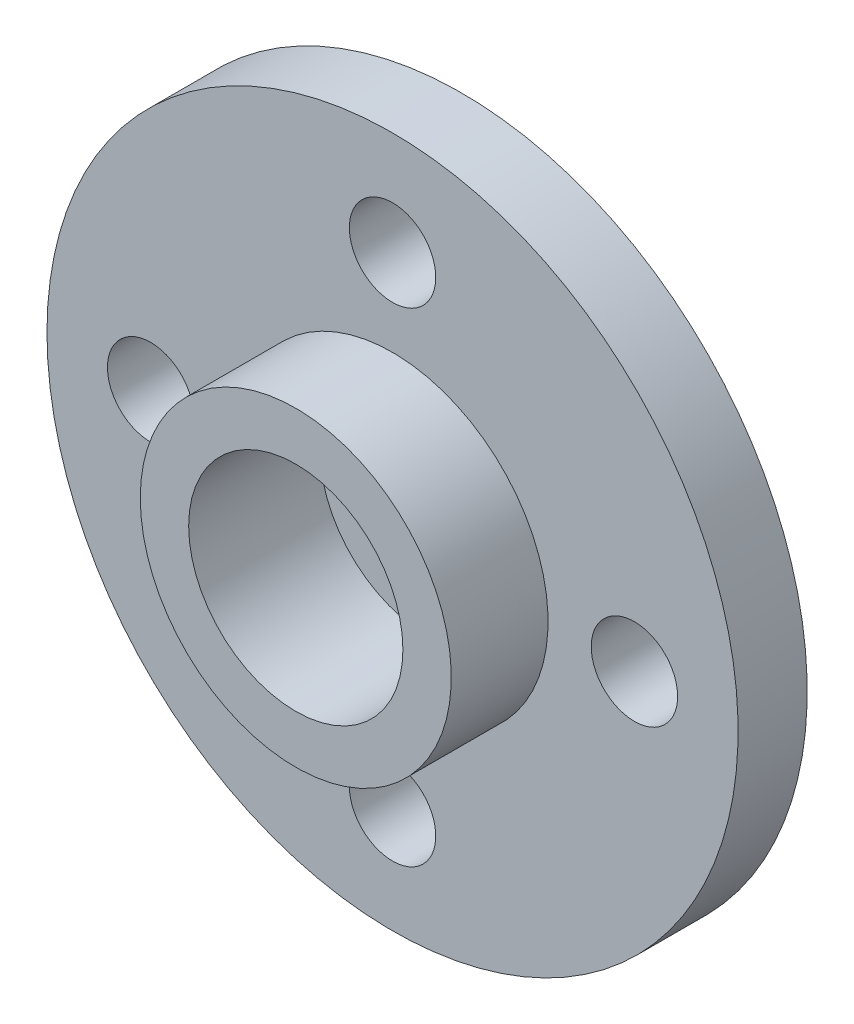
ISO-10303-21;
HEADER;
FILE_DESCRIPTION(('STEP AP214'),'2;1');
FILE_NAME('part.step','',(''),(''),'','','');
FILE_SCHEMA(('AUTOMOTIVE_DESIGN { 1 0 10303 214 1 1 1 1 }'));
ENDSEC;
DATA;
#1=APPLICATION_CONTEXT('core data for automotive mechanical design processes');
#2=APPLICATION_PROTOCOL_DEFINITION('international standard','automotive_design',2000,#1);
#3=PRODUCT_CONTEXT('',#1,'mechanical');
#4=PRODUCT('Part','Part','',(#3));
#5=PRODUCT_RELATED_PRODUCT_CATEGORY('part','',(#4));
#6=PRODUCT_DEFINITION_FORMATION('','',#4);
#7=PRODUCT_DEFINITION_CONTEXT('part definition',#1,'design');
#8=PRODUCT_DEFINITION('design','',#6,#7);
#9=PRODUCT_DEFINITION_SHAPE('','',#8);
#10=(LENGTH_UNIT() NAMED_UNIT(*) SI_UNIT(.MILLI.,.METRE.));
#11=(NAMED_UNIT(*) PLANE_ANGLE_UNIT() SI_UNIT($,.RADIAN.));
#12=(NAMED_UNIT(*) SI_UNIT($,.STERADIAN.) SOLID_ANGLE_UNIT());
#13=UNCERTAINTY_MEASURE_WITH_UNIT(LENGTH_MEASURE(1.E-05),#10,'distance_accuracy_value','');
#14=(GEOMETRIC_REPRESENTATION_CONTEXT(3) GLOBAL_UNCERTAINTY_ASSIGNED_CONTEXT((#13)) GLOBAL_UNIT_ASSIGNED_CONTEXT((#10,
#11,#12)) REPRESENTATION_CONTEXT('',''));
#15=CARTESIAN_POINT('',(0.,0.,0.));
#16=DIRECTION('',(0.,0.,1.));
#17=DIRECTION('',(1.,0.,0.));
#18=AXIS2_PLACEMENT_3D('',#15,#16,#17);
#19=CARTESIAN_POINT('',(-39.10264651977,-19.8999981269,-37.074));
#20=DIRECTION('',(0.,0.,-1.));
#21=DIRECTION('',(1.,0.,0.));
#22=AXIS2_PLACEMENT_3D('',#19,#20,#21);
#23=CYLINDRICAL_SURFACE('',#22,1.6);
#24=CARTESIAN_POINT('',(-39.10264651977,-19.8999981269,-35.124));
#25=DIRECTION('',(0.,0.,1.));
#26=DIRECTION('',(-1.,0.,0.));
#27=AXIS2_PLACEMENT_3D('',#24,#25,#26);
#28=CIRCLE('',#27,1.6);
#29=CARTESIAN_POINT('',(-40.70264651977,-19.8999981269,-35.124));
#30=VERTEX_POINT('',#29);
#31=EDGE_CURVE('E130',#30,#30,#28,.T.);
#32=ORIENTED_EDGE('',*,*,#31,.T.);
#33=DIRECTION('',(0.,0.,-1.));
#34=VECTOR('',#33,1.);
#35=CARTESIAN_POINT('',(-40.70264651977,-19.8999981269,-37.074));
#36=LINE('',#35,#34);
#37=CARTESIAN_POINT('',(-40.70264651977,-19.8999981269,-36.124));
#38=VERTEX_POINT('',#37);
#39=EDGE_CURVE('E11',#30,#38,#36,.T.);
#40=ORIENTED_EDGE('',*,*,#39,.T.);
#41=CARTESIAN_POINT('',(-39.10264651977,-19.8999981269,-36.124));
#42=DIRECTION('',(0.,0.,-1.));
#43=DIRECTION('',(1.,0.,0.));
#44=AXIS2_PLACEMENT_3D('',#41,#42,#43);
#45=CIRCLE('',#44,1.6);
#46=EDGE_CURVE('E110',#38,#38,#45,.T.);
#47=ORIENTED_EDGE('',*,*,#46,.T.);
#48=ORIENTED_EDGE('',*,*,#39,.F.);
#49=EDGE_LOOP('',(#32,#40,#47,#48));
#50=FACE_BOUND('',#49,.T.);
#51=ADVANCED_FACE('F17',(#50),#23,.F.);
#52=CARTESIAN_POINT('',(-39.10264651977,-26.9,-36.124));
#53=DIRECTION('',(0.,0.,-1.));
#54=DIRECTION('',(1.,0.,0.));
#55=AXIS2_PLACEMENT_3D('',#52,#53,#54);
#56=CYLINDRICAL_SURFACE('',#55,1.25);
#57=CARTESIAN_POINT('',(-39.10264651977,-26.9,-34.124));
#58=DIRECTION('',(0.,0.,1.));
#59=DIRECTION('',(-1.,0.,0.));
#60=AXIS2_PLACEMENT_3D('',#57,#58,#59);
#61=CIRCLE('',#60,1.25);
#62=CARTESIAN_POINT('',(-40.35264651977,-26.9,-34.124));
#63=VERTEX_POINT('',#62);
#64=EDGE_CURVE('E153',#63,#63,#61,.T.);
#65=ORIENTED_EDGE('',*,*,#64,.T.);
#66=DIRECTION('',(0.,0.,-1.));
#67=VECTOR('',#66,1.);
#68=CARTESIAN_POINT('',(-40.35264651977,-26.9,-36.124));
#69=LINE('',#68,#67);
#70=CARTESIAN_POINT('',(-40.35264651977,-26.9,-36.124));
#71=VERTEX_POINT('',#70);
#72=EDGE_CURVE('E27',#63,#71,#69,.T.);
#73=ORIENTED_EDGE('',*,*,#72,.T.);
#74=CARTESIAN_POINT('',(-39.10264651977,-26.9,-36.124));
#75=DIRECTION('',(0.,0.,-1.));
#76=DIRECTION('',(1.,0.,0.));
#77=AXIS2_PLACEMENT_3D('',#74,#75,#76);
#78=CIRCLE('',#77,1.25);
#79=EDGE_CURVE('E119',#71,#71,#78,.T.);
#80=ORIENTED_EDGE('',*,*,#79,.T.);
#81=ORIENTED_EDGE('',*,*,#72,.F.);
#82=EDGE_LOOP('',(#65,#73,#80,#81));
#83=FACE_BOUND('',#82,.T.);
#84=ADVANCED_FACE('F220',(#83),#56,.F.);
#85=CARTESIAN_POINT('',(-32.10264464667,-19.8999981269,-36.124));
#86=DIRECTION('',(0.,0.,-1.));
#87=DIRECTION('',(0.,1.,0.));
#88=AXIS2_PLACEMENT_3D('',#85,#86,#87);
#89=CYLINDRICAL_SURFACE('',#88,1.25);
#90=CARTESIAN_POINT('',(-32.10264464667,-19.8999981269,-34.124));
#91=DIRECTION('',(0.,0.,1.));
#92=DIRECTION('',(0.,-1.,0.));
#93=AXIS2_PLACEMENT_3D('',#90,#91,#92);
#94=CIRCLE('',#93,1.25);
#95=CARTESIAN_POINT('',(-32.10264464667,-21.1499981269,-34.124));
#96=VERTEX_POINT('',#95);
#97=EDGE_CURVE('E149',#96,#96,#94,.T.);
#98=ORIENTED_EDGE('',*,*,#97,.T.);
#99=DIRECTION('',(0.,0.,-1.));
#100=VECTOR('',#99,1.);
#101=CARTESIAN_POINT('',(-32.10264464667,-21.1499981269,-36.124));
#102=LINE('',#101,#100);
#103=CARTESIAN_POINT('',(-32.10264464667,-21.1499981269,-36.124));
#104=VERTEX_POINT('',#103);
#105=EDGE_CURVE('E117',#96,#104,#102,.T.);
#106=ORIENTED_EDGE('',*,*,#105,.T.);
#107=CARTESIAN_POINT('',(-32.10264464667,-19.8999981269,-36.124));
#108=DIRECTION('',(0.,0.,-1.));
#109=DIRECTION('',(0.,1.,0.));
#110=AXIS2_PLACEMENT_3D('',#107,#108,#109);
#111=CIRCLE('',#110,1.25);
#112=EDGE_CURVE('E161',#104,#104,#111,.T.);
#113=ORIENTED_EDGE('',*,*,#112,.T.);
#114=ORIENTED_EDGE('',*,*,#105,.F.);
#115=EDGE_LOOP('',(#98,#106,#113,#114));
#116=FACE_BOUND('',#115,.T.);
#117=ADVANCED_FACE('F189',(#116),#89,.F.);
#118=CARTESIAN_POINT('',(-39.10264651977,-12.8999962538,-36.124));
#119=DIRECTION('',(0.,0.,-1.));
#120=DIRECTION('',(-1.,0.,0.));
#121=AXIS2_PLACEMENT_3D('',#118,#119,#120);
#122=CYLINDRICAL_SURFACE('',#121,1.25);
#123=CARTESIAN_POINT('',(-39.10264651977,-12.8999962538,-34.124));
#124=DIRECTION('',(0.,0.,1.));
#125=DIRECTION('',(1.,0.,0.));
#126=AXIS2_PLACEMENT_3D('',#123,#124,#125);
#127=CIRCLE('',#126,1.25);
#128=CARTESIAN_POINT('',(-37.85264651977,-12.8999962538,-34.124));
#129=VERTEX_POINT('',#128);
#130=EDGE_CURVE('E145',#129,#129,#127,.T.);
#131=ORIENTED_EDGE('',*,*,#130,.T.);
#132=DIRECTION('',(0.,0.,-1.));
#133=VECTOR('',#132,1.);
#134=CARTESIAN_POINT('',(-37.85264651977,-12.8999962538,-36.124));
#135=LINE('',#134,#133);
#136=CARTESIAN_POINT('',(-37.85264651977,-12.8999962538,-36.124));
#137=VERTEX_POINT('',#136);
#138=EDGE_CURVE('E109',#129,#137,#135,.T.);
#139=ORIENTED_EDGE('',*,*,#138,.T.);
#140=CARTESIAN_POINT('',(-39.10264651977,-12.8999962538,-36.124));
#141=DIRECTION('',(0.,0.,-1.));
#142=DIRECTION('',(-1.,0.,0.));
#143=AXIS2_PLACEMENT_3D('',#140,#141,#142);
#144=CIRCLE('',#143,1.25);
#145=EDGE_CURVE('E157',#137,#137,#144,.T.);
#146=ORIENTED_EDGE('',*,*,#145,.T.);
#147=ORIENTED_EDGE('',*,*,#138,.F.);
#148=EDGE_LOOP('',(#131,#139,#146,#147));
#149=FACE_BOUND('',#148,.T.);
#150=ADVANCED_FACE('F233',(#149),#122,.F.);
#151=CARTESIAN_POINT('',(-46.10264839287,-19.8999981269,-36.124));
#152=DIRECTION('',(0.,0.,-1.));
#153=DIRECTION('',(0.,-1.,0.));
#154=AXIS2_PLACEMENT_3D('',#151,#152,#153);
#155=CYLINDRICAL_SURFACE('',#154,1.25);
#156=CARTESIAN_POINT('',(-46.10264839287,-19.8999981269,-34.124));
#157=DIRECTION('',(0.,0.,1.));
#158=DIRECTION('',(0.,1.,0.));
#159=AXIS2_PLACEMENT_3D('',#156,#157,#158);
#160=CIRCLE('',#159,1.25);
#161=CARTESIAN_POINT('',(-46.10264839287,-18.6499981269,-34.124));
#162=VERTEX_POINT('',#161);
#163=EDGE_CURVE('E107',#162,#162,#160,.T.);
#164=ORIENTED_EDGE('',*,*,#163,.T.);
#165=DIRECTION('',(0.,0.,-1.));
#166=VECTOR('',#165,1.);
#167=CARTESIAN_POINT('',(-46.10264839287,-18.6499981269,-36.124));
#168=LINE('',#167,#166);
#169=CARTESIAN_POINT('',(-46.10264839287,-18.6499981269,-36.124));
#170=VERTEX_POINT('',#169);
#171=EDGE_CURVE('E102',#162,#170,#168,.T.);
#172=ORIENTED_EDGE('',*,*,#171,.T.);
#173=CARTESIAN_POINT('',(-46.10264839287,-19.8999981269,-36.124));
#174=DIRECTION('',(0.,0.,-1.));
#175=DIRECTION('',(0.,-1.,0.));
#176=AXIS2_PLACEMENT_3D('',#173,#174,#175);
#177=CIRCLE('',#176,1.25);
#178=EDGE_CURVE('E105',#170,#170,#177,.T.);
#179=ORIENTED_EDGE('',*,*,#178,.T.);
#180=ORIENTED_EDGE('',*,*,#171,.F.);
#181=EDGE_LOOP('',(#164,#172,#179,#180));
#182=FACE_BOUND('',#181,.T.);
#183=ADVANCED_FACE('F103',(#182),#155,.F.);
#184=CARTESIAN_POINT('',(-28.10437565297,-19.9,-36.124));
#185=DIRECTION('',(0.,0.,-1.));
#186=DIRECTION('',(0.,-1.,0.));
#187=AXIS2_PLACEMENT_3D('',#184,#185,#186);
#188=PLANE('',#187);
#189=ORIENTED_EDGE('',*,*,#46,.F.);
#190=EDGE_LOOP('',(#189));
#191=FACE_BOUND('',#190,.T.);
#192=ORIENTED_EDGE('',*,*,#79,.F.);
#193=EDGE_LOOP('',(#192));
#194=FACE_BOUND('',#193,.T.);
#195=ORIENTED_EDGE('',*,*,#112,.F.);
#196=EDGE_LOOP('',(#195));
#197=FACE_BOUND('',#196,.T.);
#198=ORIENTED_EDGE('',*,*,#145,.F.);
#199=EDGE_LOOP('',(#198));
#200=FACE_BOUND('',#199,.T.);
#201=ORIENTED_EDGE('',*,*,#178,.F.);
#202=EDGE_LOOP('',(#201));
#203=FACE_BOUND('',#202,.T.);
#204=CARTESIAN_POINT('',(-39.10264651977,-19.8999981269,-36.124));
#205=DIRECTION('',(0.,0.,1.));
#206=DIRECTION('',(1.,0.,0.));
#207=AXIS2_PLACEMENT_3D('',#204,#205,#206);
#208=CIRCLE('',#207,10.);
#209=CARTESIAN_POINT('',(-49.10264651977,-19.8999981269,-36.124));
#210=VERTEX_POINT('',#209);
#211=EDGE_CURVE('E156',#210,#210,#208,.T.);
#212=ORIENTED_EDGE('',*,*,#211,.F.);
#213=EDGE_LOOP('',(#212));
#214=FACE_BOUND('',#213,.T.);
#215=ADVANCED_FACE('F191',(#191,#194,#197,#200,#203,#214),#188,.T.);
#216=CARTESIAN_POINT('',(-39.10264651977,-19.8999981269,-36.124));
#217=DIRECTION('',(0.,0.,-1.));
#218=DIRECTION('',(1.,0.,0.));
#219=AXIS2_PLACEMENT_3D('',#216,#217,#218);
#220=CYLINDRICAL_SURFACE('',#219,10.);
#221=ORIENTED_EDGE('',*,*,#211,.T.);
#222=DIRECTION('',(0.,0.,1.));
#223=VECTOR('',#222,1.);
#224=CARTESIAN_POINT('',(-49.10264651977,-19.8999981269,-36.124));
#225=LINE('',#224,#223);
#226=CARTESIAN_POINT('',(-49.10264651977,-19.8999981269,-34.124));
#227=VERTEX_POINT('',#226);
#228=EDGE_CURVE('E177',#210,#227,#225,.T.);
#229=ORIENTED_EDGE('',*,*,#228,.T.);
#230=CARTESIAN_POINT('',(-39.10264651977,-19.8999981269,-34.124));
#231=DIRECTION('',(0.,0.,-1.));
#232=DIRECTION('',(-1.,0.,0.));
#233=AXIS2_PLACEMENT_3D('',#230,#231,#232);
#234=CIRCLE('',#233,10.);
#235=EDGE_CURVE('E141',#227,#227,#234,.T.);
#236=ORIENTED_EDGE('',*,*,#235,.T.);
#237=ORIENTED_EDGE('',*,*,#228,.F.);
#238=EDGE_LOOP('',(#221,#229,#236,#237));
#239=FACE_BOUND('',#238,.T.);
#240=ADVANCED_FACE('F194',(#239),#220,.T.);
#241=CARTESIAN_POINT('',(-39.10264565297,-19.9,-34.124));
#242=DIRECTION('',(0.,0.,1.));
#243=DIRECTION('',(1.,0.,0.));
#244=AXIS2_PLACEMENT_3D('',#241,#242,#243);
#245=PLANE('',#244);
#246=ORIENTED_EDGE('',*,*,#163,.F.);
#247=EDGE_LOOP('',(#246));
#248=FACE_BOUND('',#247,.T.);
#249=CARTESIAN_POINT('',(-39.10264651977,-19.8999981269,-34.124));
#250=DIRECTION('',(0.,0.,1.));
#251=DIRECTION('',(1.,0.,0.));
#252=AXIS2_PLACEMENT_3D('',#249,#250,#251);
#253=CIRCLE('',#252,4.5);
#254=CARTESIAN_POINT('',(-43.60264651977,-19.8999981269,-34.124));
#255=VERTEX_POINT('',#254);
#256=EDGE_CURVE('E132',#255,#255,#253,.T.);
#257=ORIENTED_EDGE('',*,*,#256,.F.);
#258=EDGE_LOOP('',(#257));
#259=FACE_BOUND('',#258,.T.);
#260=ORIENTED_EDGE('',*,*,#64,.F.);
#261=EDGE_LOOP('',(#260));
#262=FACE_BOUND('',#261,.T.);
#263=ORIENTED_EDGE('',*,*,#97,.F.);
#264=EDGE_LOOP('',(#263));
#265=FACE_BOUND('',#264,.T.);
#266=ORIENTED_EDGE('',*,*,#130,.F.);
#267=EDGE_LOOP('',(#266));
#268=FACE_BOUND('',#267,.T.);
#269=ORIENTED_EDGE('',*,*,#235,.F.);
#270=EDGE_LOOP('',(#269));
#271=FACE_BOUND('',#270,.T.);
#272=ADVANCED_FACE('F204',(#248,#259,#262,#265,#268,#271),#245,.T.);
#273=CARTESIAN_POINT('',(-39.10264651977,-19.8999981269,-31.364));
#274=DIRECTION('',(0.,0.,-1.));
#275=DIRECTION('',(1.,0.,0.));
#276=AXIS2_PLACEMENT_3D('',#273,#274,#275);
#277=CYLINDRICAL_SURFACE('',#276,4.5);
#278=ORIENTED_EDGE('',*,*,#256,.T.);
#279=DIRECTION('',(0.,0.,1.));
#280=VECTOR('',#279,1.);
#281=CARTESIAN_POINT('',(-43.60264651977,-19.8999981269,-31.364));
#282=LINE('',#281,#280);
#283=CARTESIAN_POINT('',(-43.60264651977,-19.8999981269,-31.324));
#284=VERTEX_POINT('',#283);
#285=EDGE_CURVE('E136',#255,#284,#282,.T.);
#286=ORIENTED_EDGE('',*,*,#285,.T.);
#287=CARTESIAN_POINT('',(-39.10264651977,-19.8999981269,-31.324));
#288=DIRECTION('',(0.,0.,-1.));
#289=DIRECTION('',(-1.,0.,0.));
#290=AXIS2_PLACEMENT_3D('',#287,#288,#289);
#291=CIRCLE('',#290,4.5);
#292=EDGE_CURVE('E137',#284,#284,#291,.T.);
#293=ORIENTED_EDGE('',*,*,#292,.T.);
#294=ORIENTED_EDGE('',*,*,#285,.F.);
#295=EDGE_LOOP('',(#278,#286,#293,#294));
#296=FACE_BOUND('',#295,.T.);
#297=ADVANCED_FACE('F19',(#296),#277,.T.);
#298=CARTESIAN_POINT('',(-28.10437565297,-19.9,-31.324));
#299=DIRECTION('',(0.,0.,1.));
#300=DIRECTION('',(1.,0.,0.));
#301=AXIS2_PLACEMENT_3D('',#298,#299,#300);
#302=PLANE('',#301);
#303=CARTESIAN_POINT('',(-39.10264651977,-19.8999981269,-31.324));
#304=DIRECTION('',(0.,0.,1.));
#305=DIRECTION('',(-1.,0.,0.));
#306=AXIS2_PLACEMENT_3D('',#303,#304,#305);
#307=CIRCLE('',#306,3.1);
#308=CARTESIAN_POINT('',(-42.20264651977,-19.8999981269,-31.324));
#309=VERTEX_POINT('',#308);
#310=EDGE_CURVE('E65',#309,#309,#307,.T.);
#311=ORIENTED_EDGE('',*,*,#310,.F.);
#312=EDGE_LOOP('',(#311));
#313=FACE_BOUND('',#312,.T.);
#314=ORIENTED_EDGE('',*,*,#292,.F.);
#315=EDGE_LOOP('',(#314));
#316=FACE_BOUND('',#315,.T.);
#317=ADVANCED_FACE('F214',(#313,#316),#302,.T.);
#318=CARTESIAN_POINT('',(-39.10264651977,-19.8999981269,-35.124));
#319=DIRECTION('',(0.,0.,1.));
#320=DIRECTION('',(1.,0.,0.));
#321=AXIS2_PLACEMENT_3D('',#318,#319,#320);
#322=CYLINDRICAL_SURFACE('',#321,3.1);
#323=CARTESIAN_POINT('',(-39.10264651977,-19.8999981269,-35.124));
#324=DIRECTION('',(0.,0.,-1.));
#325=DIRECTION('',(-1.,0.,0.));
#326=AXIS2_PLACEMENT_3D('',#323,#324,#325);
#327=CIRCLE('',#326,3.1);
#328=CARTESIAN_POINT('',(-42.20264651977,-19.8999981269,-35.124));
#329=VERTEX_POINT('',#328);
#330=EDGE_CURVE('E127',#329,#329,#327,.T.);
#331=ORIENTED_EDGE('',*,*,#330,.T.);
#332=DIRECTION('',(0.,0.,1.));
#333=VECTOR('',#332,1.);
#334=CARTESIAN_POINT('',(-42.20264651977,-19.8999981269,-35.124));
#335=LINE('',#334,#333);
#336=EDGE_CURVE('E138',#329,#309,#335,.T.);
#337=ORIENTED_EDGE('',*,*,#336,.T.);
#338=ORIENTED_EDGE('',*,*,#310,.T.);
#339=ORIENTED_EDGE('',*,*,#336,.F.);
#340=EDGE_LOOP('',(#331,#337,#338,#339));
#341=FACE_BOUND('',#340,.T.);
#342=ADVANCED_FACE('F230',(#341),#322,.F.);
#343=CARTESIAN_POINT('',(-28.10437565297,-19.9,-35.124));
#344=DIRECTION('',(0.,0.,1.));
#345=DIRECTION('',(1.,0.,0.));
#346=AXIS2_PLACEMENT_3D('',#343,#344,#345);
#347=PLANE('',#346);
#348=ORIENTED_EDGE('',*,*,#31,.F.);
#349=EDGE_LOOP('',(#348));
#350=FACE_BOUND('',#349,.T.);
#351=ORIENTED_EDGE('',*,*,#330,.F.);
#352=EDGE_LOOP('',(#351));
#353=FACE_BOUND('',#352,.T.);
#354=ADVANCED_FACE('F248',(#350,#353),#347,.T.);
#355=CLOSED_SHELL('',(#51,#84,#117,#150,#183,#215,#240,#272,#297,#317,#342,#354));
#356=MANIFOLD_SOLID_BREP('B1',#355);
#357=ADVANCED_BREP_SHAPE_REPRESENTATION('',(#18,#356),#14);
#358=SHAPE_DEFINITION_REPRESENTATION(#9,#357);
ENDSEC;
END-ISO-10303-21;
